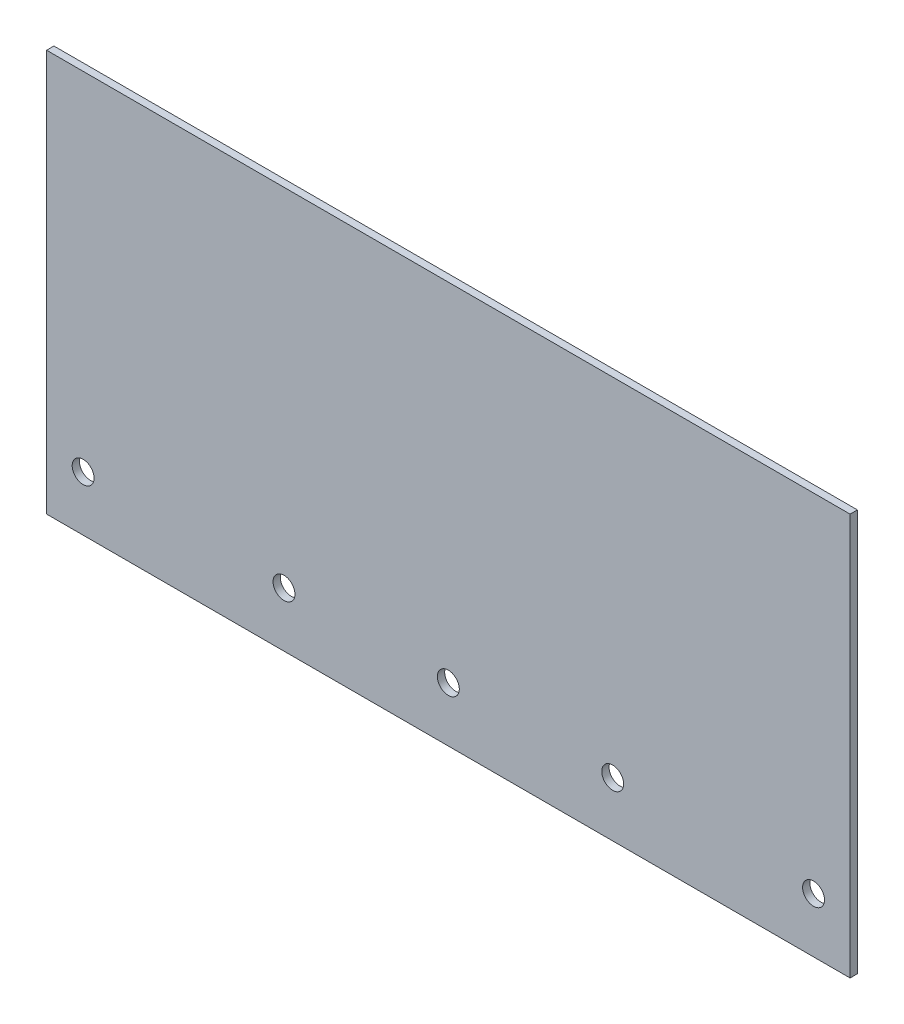
ISO-10303-21;
HEADER;
FILE_DESCRIPTION(('STEP AP214'),'2;1');
FILE_NAME('part.step','',(''),(''),'','','');
FILE_SCHEMA(('AUTOMOTIVE_DESIGN { 1 0 10303 214 1 1 1 1 }'));
ENDSEC;
DATA;
#1=APPLICATION_CONTEXT('core data for automotive mechanical design processes');
#2=APPLICATION_PROTOCOL_DEFINITION('international standard','automotive_design',2000,#1);
#3=PRODUCT_CONTEXT('',#1,'mechanical');
#4=PRODUCT('Part','Part','',(#3));
#5=PRODUCT_RELATED_PRODUCT_CATEGORY('part','',(#4));
#6=PRODUCT_DEFINITION_FORMATION('','',#4);
#7=PRODUCT_DEFINITION_CONTEXT('part definition',#1,'design');
#8=PRODUCT_DEFINITION('design','',#6,#7);
#9=PRODUCT_DEFINITION_SHAPE('','',#8);
#10=(LENGTH_UNIT() NAMED_UNIT(*) SI_UNIT(.MILLI.,.METRE.));
#11=(NAMED_UNIT(*) PLANE_ANGLE_UNIT() SI_UNIT($,.RADIAN.));
#12=(NAMED_UNIT(*) SI_UNIT($,.STERADIAN.) SOLID_ANGLE_UNIT());
#13=UNCERTAINTY_MEASURE_WITH_UNIT(LENGTH_MEASURE(1.E-05),#10,'distance_accuracy_value','');
#14=(GEOMETRIC_REPRESENTATION_CONTEXT(3) GLOBAL_UNCERTAINTY_ASSIGNED_CONTEXT((#13)) GLOBAL_UNIT_ASSIGNED_CONTEXT((#10,
#11,#12)) REPRESENTATION_CONTEXT('',''));
#15=CARTESIAN_POINT('',(0.,0.,0.));
#16=DIRECTION('',(0.,0.,1.));
#17=DIRECTION('',(1.,0.,0.));
#18=AXIS2_PLACEMENT_3D('',#15,#16,#17);
#19=CARTESIAN_POINT('',(110.,-55.,2.));
#20=DIRECTION('',(-1.,0.,0.));
#21=DIRECTION('',(0.,0.,1.));
#22=AXIS2_PLACEMENT_3D('',#19,#20,#21);
#23=PLANE('',#22);
#24=DIRECTION('',(0.,1.,0.));
#25=VECTOR('',#24,1.);
#26=CARTESIAN_POINT('',(110.,-55.,0.));
#27=LINE('',#26,#25);
#28=CARTESIAN_POINT('',(110.,-55.,0.));
#29=VERTEX_POINT('',#28);
#30=CARTESIAN_POINT('',(110.,55.,0.));
#31=VERTEX_POINT('',#30);
#32=EDGE_CURVE('E96',#29,#31,#27,.T.);
#33=ORIENTED_EDGE('',*,*,#32,.T.);
#34=DIRECTION('',(0.,0.,-1.));
#35=VECTOR('',#34,1.);
#36=CARTESIAN_POINT('',(110.,55.,2.));
#37=LINE('',#36,#35);
#38=CARTESIAN_POINT('',(110.,55.,2.));
#39=VERTEX_POINT('',#38);
#40=EDGE_CURVE('E11',#39,#31,#37,.T.);
#41=ORIENTED_EDGE('',*,*,#40,.F.);
#42=DIRECTION('',(0.,1.,0.));
#43=VECTOR('',#42,1.);
#44=CARTESIAN_POINT('',(110.,-55.,2.));
#45=LINE('',#44,#43);
#46=CARTESIAN_POINT('',(110.,-55.,2.));
#47=VERTEX_POINT('',#46);
#48=EDGE_CURVE('E84',#47,#39,#45,.T.);
#49=ORIENTED_EDGE('',*,*,#48,.F.);
#50=DIRECTION('',(0.,0.,-1.));
#51=VECTOR('',#50,1.);
#52=CARTESIAN_POINT('',(110.,-55.,2.));
#53=LINE('',#52,#51);
#54=EDGE_CURVE('E92',#47,#29,#53,.T.);
#55=ORIENTED_EDGE('',*,*,#54,.T.);
#56=EDGE_LOOP('',(#33,#41,#49,#55));
#57=FACE_BOUND('',#56,.T.);
#58=ADVANCED_FACE('F33',(#57),#23,.F.);
#59=CARTESIAN_POINT('',(-110.,55.,2.));
#60=DIRECTION('',(0.,-1.,0.));
#61=DIRECTION('',(0.,0.,-1.));
#62=AXIS2_PLACEMENT_3D('',#59,#60,#61);
#63=PLANE('',#62);
#64=DIRECTION('',(-1.,0.,0.));
#65=VECTOR('',#64,1.);
#66=CARTESIAN_POINT('',(-110.,55.,0.));
#67=LINE('',#66,#65);
#68=CARTESIAN_POINT('',(-110.,55.,0.));
#69=VERTEX_POINT('',#68);
#70=EDGE_CURVE('E88',#31,#69,#67,.T.);
#71=ORIENTED_EDGE('',*,*,#70,.T.);
#72=DIRECTION('',(0.,0.,-1.));
#73=VECTOR('',#72,1.);
#74=CARTESIAN_POINT('',(-110.,55.,2.));
#75=LINE('',#74,#73);
#76=CARTESIAN_POINT('',(-110.,55.,2.));
#77=VERTEX_POINT('',#76);
#78=EDGE_CURVE('E41',#77,#69,#75,.T.);
#79=ORIENTED_EDGE('',*,*,#78,.F.);
#80=DIRECTION('',(-1.,0.,0.));
#81=VECTOR('',#80,1.);
#82=CARTESIAN_POINT('',(-110.,55.,2.));
#83=LINE('',#82,#81);
#84=EDGE_CURVE('E79',#39,#77,#83,.T.);
#85=ORIENTED_EDGE('',*,*,#84,.F.);
#86=ORIENTED_EDGE('',*,*,#40,.T.);
#87=EDGE_LOOP('',(#71,#79,#85,#86));
#88=FACE_BOUND('',#87,.T.);
#89=ADVANCED_FACE('F87',(#88),#63,.F.);
#90=CARTESIAN_POINT('',(-110.,-55.,2.));
#91=DIRECTION('',(1.,0.,0.));
#92=DIRECTION('',(0.,0.,-1.));
#93=AXIS2_PLACEMENT_3D('',#90,#91,#92);
#94=PLANE('',#93);
#95=DIRECTION('',(0.,-1.,0.));
#96=VECTOR('',#95,1.);
#97=CARTESIAN_POINT('',(-110.,-55.,0.));
#98=LINE('',#97,#96);
#99=CARTESIAN_POINT('',(-110.,-55.,0.));
#100=VERTEX_POINT('',#99);
#101=EDGE_CURVE('E66',#69,#100,#98,.T.);
#102=ORIENTED_EDGE('',*,*,#101,.T.);
#103=DIRECTION('',(0.,0.,-1.));
#104=VECTOR('',#103,1.);
#105=CARTESIAN_POINT('',(-110.,-55.,2.));
#106=LINE('',#105,#104);
#107=CARTESIAN_POINT('',(-110.,-55.,2.));
#108=VERTEX_POINT('',#107);
#109=EDGE_CURVE('E89',#108,#100,#106,.T.);
#110=ORIENTED_EDGE('',*,*,#109,.F.);
#111=DIRECTION('',(0.,-1.,0.));
#112=VECTOR('',#111,1.);
#113=CARTESIAN_POINT('',(-110.,-55.,2.));
#114=LINE('',#113,#112);
#115=EDGE_CURVE('E82',#77,#108,#114,.T.);
#116=ORIENTED_EDGE('',*,*,#115,.F.);
#117=ORIENTED_EDGE('',*,*,#78,.T.);
#118=EDGE_LOOP('',(#102,#110,#116,#117));
#119=FACE_BOUND('',#118,.T.);
#120=ADVANCED_FACE('F90',(#119),#94,.F.);
#121=CARTESIAN_POINT('',(-110.,-55.,2.));
#122=DIRECTION('',(0.,1.,0.));
#123=DIRECTION('',(0.,0.,1.));
#124=AXIS2_PLACEMENT_3D('',#121,#122,#123);
#125=PLANE('',#124);
#126=DIRECTION('',(1.,0.,0.));
#127=VECTOR('',#126,1.);
#128=CARTESIAN_POINT('',(-110.,-55.,0.));
#129=LINE('',#128,#127);
#130=EDGE_CURVE('E72',#100,#29,#129,.T.);
#131=ORIENTED_EDGE('',*,*,#130,.T.);
#132=ORIENTED_EDGE('',*,*,#54,.F.);
#133=DIRECTION('',(1.,0.,0.));
#134=VECTOR('',#133,1.);
#135=CARTESIAN_POINT('',(-110.,-55.,2.));
#136=LINE('',#135,#134);
#137=EDGE_CURVE('E49',#108,#47,#136,.T.);
#138=ORIENTED_EDGE('',*,*,#137,.F.);
#139=ORIENTED_EDGE('',*,*,#109,.T.);
#140=EDGE_LOOP('',(#131,#132,#138,#139));
#141=FACE_BOUND('',#140,.T.);
#142=ADVANCED_FACE('F104',(#141),#125,.F.);
#143=CARTESIAN_POINT('',(0.,0.,2.));
#144=DIRECTION('',(0.,0.,-1.));
#145=DIRECTION('',(-1.,0.,0.));
#146=AXIS2_PLACEMENT_3D('',#143,#144,#145);
#147=PLANE('',#146);
#148=CARTESIAN_POINT('',(100.,-40.,2.));
#149=DIRECTION('',(0.,0.,1.));
#150=DIRECTION('',(1.,0.,0.));
#151=AXIS2_PLACEMENT_3D('',#148,#149,#150);
#152=CIRCLE('',#151,3.00000000000001);
#153=CARTESIAN_POINT('',(103.,-40.,2.));
#154=VERTEX_POINT('',#153);
#155=EDGE_CURVE('E134',#154,#154,#152,.T.);
#156=ORIENTED_EDGE('',*,*,#155,.F.);
#157=EDGE_LOOP('',(#156));
#158=FACE_BOUND('',#157,.T.);
#159=CARTESIAN_POINT('',(45.,-40.,2.));
#160=DIRECTION('',(0.,0.,1.));
#161=DIRECTION('',(1.,0.,0.));
#162=AXIS2_PLACEMENT_3D('',#159,#160,#161);
#163=CIRCLE('',#162,3.);
#164=CARTESIAN_POINT('',(48.,-40.,2.));
#165=VERTEX_POINT('',#164);
#166=EDGE_CURVE('E128',#165,#165,#163,.T.);
#167=ORIENTED_EDGE('',*,*,#166,.F.);
#168=EDGE_LOOP('',(#167));
#169=FACE_BOUND('',#168,.T.);
#170=CARTESIAN_POINT('',(-45.,-40.,2.));
#171=DIRECTION('',(0.,0.,1.));
#172=DIRECTION('',(1.,0.,0.));
#173=AXIS2_PLACEMENT_3D('',#170,#171,#172);
#174=CIRCLE('',#173,3.);
#175=CARTESIAN_POINT('',(-42.,-40.,2.));
#176=VERTEX_POINT('',#175);
#177=EDGE_CURVE('E122',#176,#176,#174,.T.);
#178=ORIENTED_EDGE('',*,*,#177,.F.);
#179=EDGE_LOOP('',(#178));
#180=FACE_BOUND('',#179,.T.);
#181=CARTESIAN_POINT('',(0.,-40.,2.));
#182=DIRECTION('',(0.,0.,1.));
#183=DIRECTION('',(1.,0.,0.));
#184=AXIS2_PLACEMENT_3D('',#181,#182,#183);
#185=CIRCLE('',#184,3.00000000000001);
#186=CARTESIAN_POINT('',(3.,-40.,2.));
#187=VERTEX_POINT('',#186);
#188=EDGE_CURVE('E116',#187,#187,#185,.T.);
#189=ORIENTED_EDGE('',*,*,#188,.F.);
#190=EDGE_LOOP('',(#189));
#191=FACE_BOUND('',#190,.T.);
#192=CARTESIAN_POINT('',(-100.,-40.,2.));
#193=DIRECTION('',(0.,0.,1.));
#194=DIRECTION('',(1.,0.,0.));
#195=AXIS2_PLACEMENT_3D('',#192,#193,#194);
#196=CIRCLE('',#195,3.00000000000001);
#197=CARTESIAN_POINT('',(-97.,-40.,2.));
#198=VERTEX_POINT('',#197);
#199=EDGE_CURVE('E110',#198,#198,#196,.T.);
#200=ORIENTED_EDGE('',*,*,#199,.F.);
#201=EDGE_LOOP('',(#200));
#202=FACE_BOUND('',#201,.T.);
#203=ORIENTED_EDGE('',*,*,#48,.T.);
#204=ORIENTED_EDGE('',*,*,#84,.T.);
#205=ORIENTED_EDGE('',*,*,#115,.T.);
#206=ORIENTED_EDGE('',*,*,#137,.T.);
#207=EDGE_LOOP('',(#203,#204,#205,#206));
#208=FACE_BOUND('',#207,.T.);
#209=ADVANCED_FACE('F80',(#158,#169,#180,#191,#202,#208),#147,.F.);
#210=CARTESIAN_POINT('',(0.,0.,0.));
#211=DIRECTION('',(0.,0.,-1.));
#212=DIRECTION('',(-1.,0.,0.));
#213=AXIS2_PLACEMENT_3D('',#210,#211,#212);
#214=PLANE('',#213);
#215=CARTESIAN_POINT('',(100.,-40.,0.));
#216=DIRECTION('',(0.,0.,1.));
#217=DIRECTION('',(1.,0.,0.));
#218=AXIS2_PLACEMENT_3D('',#215,#216,#217);
#219=CIRCLE('',#218,3.00000000000001);
#220=CARTESIAN_POINT('',(103.,-40.,0.));
#221=VERTEX_POINT('',#220);
#222=EDGE_CURVE('E131',#221,#221,#219,.T.);
#223=ORIENTED_EDGE('',*,*,#222,.T.);
#224=EDGE_LOOP('',(#223));
#225=FACE_BOUND('',#224,.T.);
#226=CARTESIAN_POINT('',(45.,-40.,0.));
#227=DIRECTION('',(0.,0.,1.));
#228=DIRECTION('',(1.,0.,0.));
#229=AXIS2_PLACEMENT_3D('',#226,#227,#228);
#230=CIRCLE('',#229,3.);
#231=CARTESIAN_POINT('',(48.,-40.,0.));
#232=VERTEX_POINT('',#231);
#233=EDGE_CURVE('E125',#232,#232,#230,.T.);
#234=ORIENTED_EDGE('',*,*,#233,.T.);
#235=EDGE_LOOP('',(#234));
#236=FACE_BOUND('',#235,.T.);
#237=CARTESIAN_POINT('',(-45.,-40.,0.));
#238=DIRECTION('',(0.,0.,1.));
#239=DIRECTION('',(1.,0.,0.));
#240=AXIS2_PLACEMENT_3D('',#237,#238,#239);
#241=CIRCLE('',#240,3.);
#242=CARTESIAN_POINT('',(-42.,-40.,0.));
#243=VERTEX_POINT('',#242);
#244=EDGE_CURVE('E119',#243,#243,#241,.T.);
#245=ORIENTED_EDGE('',*,*,#244,.T.);
#246=EDGE_LOOP('',(#245));
#247=FACE_BOUND('',#246,.T.);
#248=CARTESIAN_POINT('',(0.,-40.,0.));
#249=DIRECTION('',(0.,0.,1.));
#250=DIRECTION('',(1.,0.,0.));
#251=AXIS2_PLACEMENT_3D('',#248,#249,#250);
#252=CIRCLE('',#251,3.00000000000001);
#253=CARTESIAN_POINT('',(3.,-40.,0.));
#254=VERTEX_POINT('',#253);
#255=EDGE_CURVE('E113',#254,#254,#252,.T.);
#256=ORIENTED_EDGE('',*,*,#255,.T.);
#257=EDGE_LOOP('',(#256));
#258=FACE_BOUND('',#257,.T.);
#259=CARTESIAN_POINT('',(-100.,-40.,0.));
#260=DIRECTION('',(0.,0.,1.));
#261=DIRECTION('',(1.,0.,0.));
#262=AXIS2_PLACEMENT_3D('',#259,#260,#261);
#263=CIRCLE('',#262,3.00000000000001);
#264=CARTESIAN_POINT('',(-97.,-40.,0.));
#265=VERTEX_POINT('',#264);
#266=EDGE_CURVE('E99',#265,#265,#263,.T.);
#267=ORIENTED_EDGE('',*,*,#266,.T.);
#268=EDGE_LOOP('',(#267));
#269=FACE_BOUND('',#268,.T.);
#270=ORIENTED_EDGE('',*,*,#32,.F.);
#271=ORIENTED_EDGE('',*,*,#130,.F.);
#272=ORIENTED_EDGE('',*,*,#101,.F.);
#273=ORIENTED_EDGE('',*,*,#70,.F.);
#274=EDGE_LOOP('',(#270,#271,#272,#273));
#275=FACE_BOUND('',#274,.T.);
#276=ADVANCED_FACE('F107',(#225,#236,#247,#258,#269,#275),#214,.T.);
#277=CARTESIAN_POINT('',(-100.,-40.,0.));
#278=DIRECTION('',(0.,0.,1.));
#279=DIRECTION('',(1.,0.,0.));
#280=AXIS2_PLACEMENT_3D('',#277,#278,#279);
#281=CYLINDRICAL_SURFACE('',#280,3.00000000000001);
#282=ORIENTED_EDGE('',*,*,#266,.F.);
#283=EDGE_LOOP('',(#282));
#284=FACE_BOUND('',#283,.T.);
#285=ORIENTED_EDGE('',*,*,#199,.T.);
#286=EDGE_LOOP('',(#285));
#287=FACE_BOUND('',#286,.T.);
#288=ADVANCED_FACE('F160',(#284,#287),#281,.F.);
#289=CARTESIAN_POINT('',(0.,-40.,0.));
#290=DIRECTION('',(0.,0.,1.));
#291=DIRECTION('',(1.,0.,0.));
#292=AXIS2_PLACEMENT_3D('',#289,#290,#291);
#293=CYLINDRICAL_SURFACE('',#292,3.00000000000001);
#294=ORIENTED_EDGE('',*,*,#255,.F.);
#295=EDGE_LOOP('',(#294));
#296=FACE_BOUND('',#295,.T.);
#297=ORIENTED_EDGE('',*,*,#188,.T.);
#298=EDGE_LOOP('',(#297));
#299=FACE_BOUND('',#298,.T.);
#300=ADVANCED_FACE('F162',(#296,#299),#293,.F.);
#301=CARTESIAN_POINT('',(-45.,-40.,0.));
#302=DIRECTION('',(0.,0.,1.));
#303=DIRECTION('',(1.,0.,0.));
#304=AXIS2_PLACEMENT_3D('',#301,#302,#303);
#305=CYLINDRICAL_SURFACE('',#304,3.);
#306=ORIENTED_EDGE('',*,*,#244,.F.);
#307=EDGE_LOOP('',(#306));
#308=FACE_BOUND('',#307,.T.);
#309=ORIENTED_EDGE('',*,*,#177,.T.);
#310=EDGE_LOOP('',(#309));
#311=FACE_BOUND('',#310,.T.);
#312=ADVANCED_FACE('F169',(#308,#311),#305,.F.);
#313=CARTESIAN_POINT('',(45.,-40.,0.));
#314=DIRECTION('',(0.,0.,1.));
#315=DIRECTION('',(1.,0.,0.));
#316=AXIS2_PLACEMENT_3D('',#313,#314,#315);
#317=CYLINDRICAL_SURFACE('',#316,3.);
#318=ORIENTED_EDGE('',*,*,#233,.F.);
#319=EDGE_LOOP('',(#318));
#320=FACE_BOUND('',#319,.T.);
#321=ORIENTED_EDGE('',*,*,#166,.T.);
#322=EDGE_LOOP('',(#321));
#323=FACE_BOUND('',#322,.T.);
#324=ADVANCED_FACE('F145',(#320,#323),#317,.F.);
#325=CARTESIAN_POINT('',(100.,-40.,0.));
#326=DIRECTION('',(0.,0.,1.));
#327=DIRECTION('',(1.,0.,0.));
#328=AXIS2_PLACEMENT_3D('',#325,#326,#327);
#329=CYLINDRICAL_SURFACE('',#328,3.00000000000001);
#330=ORIENTED_EDGE('',*,*,#222,.F.);
#331=EDGE_LOOP('',(#330));
#332=FACE_BOUND('',#331,.T.);
#333=ORIENTED_EDGE('',*,*,#155,.T.);
#334=EDGE_LOOP('',(#333));
#335=FACE_BOUND('',#334,.T.);
#336=ADVANCED_FACE('F142',(#332,#335),#329,.F.);
#337=CLOSED_SHELL('',(#58,#89,#120,#142,#209,#276,#288,#300,#312,#324,#336));
#338=MANIFOLD_SOLID_BREP('B2',#337);
#339=ADVANCED_BREP_SHAPE_REPRESENTATION('',(#18,#338),#14);
#340=SHAPE_DEFINITION_REPRESENTATION(#9,#339);
ENDSEC;
END-ISO-10303-21;
